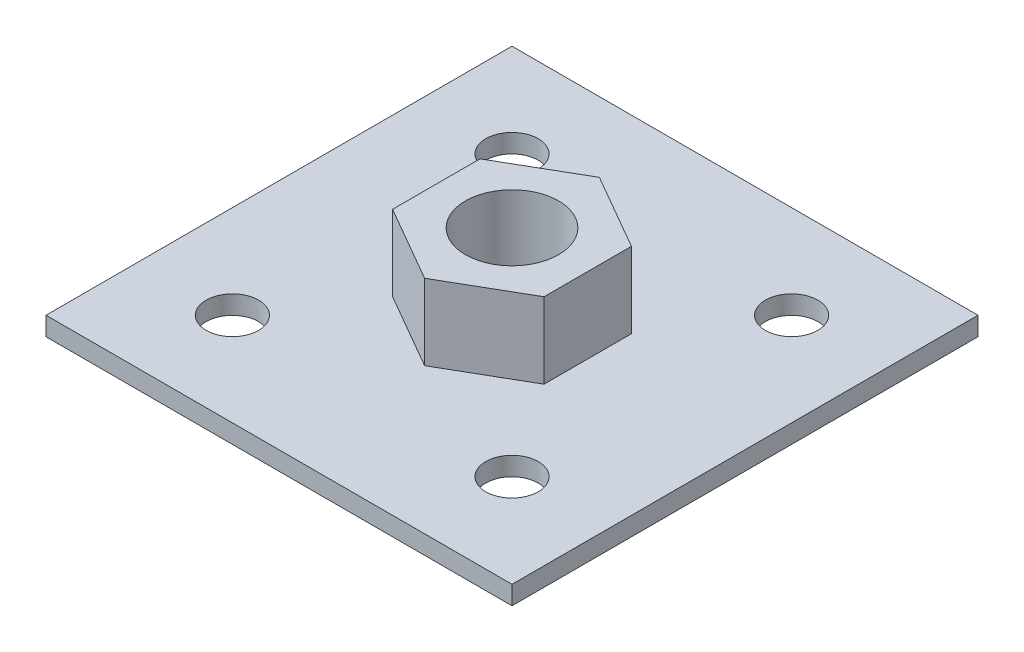
ISO-10303-21;
HEADER;
FILE_DESCRIPTION(('STEP AP214'),'2;1');
FILE_NAME('part.step','',(''),(''),'','','');
FILE_SCHEMA(('AUTOMOTIVE_DESIGN { 1 0 10303 214 1 1 1 1 }'));
ENDSEC;
DATA;
#1=APPLICATION_CONTEXT('core data for automotive mechanical design processes');
#2=APPLICATION_PROTOCOL_DEFINITION('international standard','automotive_design',2000,#1);
#3=PRODUCT_CONTEXT('',#1,'mechanical');
#4=PRODUCT('Part','Part','',(#3));
#5=PRODUCT_RELATED_PRODUCT_CATEGORY('part','',(#4));
#6=PRODUCT_DEFINITION_FORMATION('','',#4);
#7=PRODUCT_DEFINITION_CONTEXT('part definition',#1,'design');
#8=PRODUCT_DEFINITION('design','',#6,#7);
#9=PRODUCT_DEFINITION_SHAPE('','',#8);
#10=(LENGTH_UNIT() NAMED_UNIT(*) SI_UNIT(.MILLI.,.METRE.));
#11=(NAMED_UNIT(*) PLANE_ANGLE_UNIT() SI_UNIT($,.RADIAN.));
#12=(NAMED_UNIT(*) SI_UNIT($,.STERADIAN.) SOLID_ANGLE_UNIT());
#13=UNCERTAINTY_MEASURE_WITH_UNIT(LENGTH_MEASURE(1.E-05),#10,'distance_accuracy_value','');
#14=(GEOMETRIC_REPRESENTATION_CONTEXT(3) GLOBAL_UNCERTAINTY_ASSIGNED_CONTEXT((#13)) GLOBAL_UNIT_ASSIGNED_CONTEXT((#10,
#11,#12)) REPRESENTATION_CONTEXT('',''));
#15=CARTESIAN_POINT('',(0.,0.,0.));
#16=DIRECTION('',(0.,0.,1.));
#17=DIRECTION('',(1.,0.,0.));
#18=AXIS2_PLACEMENT_3D('',#15,#16,#17);
#19=CARTESIAN_POINT('',(0.,1.6,0.));
#20=DIRECTION('',(0.,-1.,0.));
#21=DIRECTION('',(0.,0.,-1.));
#22=AXIS2_PLACEMENT_3D('',#19,#20,#21);
#23=PLANE('',#22);
#24=CARTESIAN_POINT('',(12.,1.6,12.));
#25=DIRECTION('',(0.,1.,0.));
#26=DIRECTION('',(0.,0.,1.));
#27=AXIS2_PLACEMENT_3D('',#24,#25,#26);
#28=CIRCLE('',#27,2.25);
#29=CARTESIAN_POINT('',(12.,1.6,14.25));
#30=VERTEX_POINT('',#29);
#31=EDGE_CURVE('E133',#30,#30,#28,.T.);
#32=ORIENTED_EDGE('',*,*,#31,.F.);
#33=EDGE_LOOP('',(#32));
#34=FACE_BOUND('',#33,.T.);
#35=CARTESIAN_POINT('',(-12.,1.6,12.));
#36=DIRECTION('',(0.,1.,0.));
#37=DIRECTION('',(0.,0.,1.));
#38=AXIS2_PLACEMENT_3D('',#35,#36,#37);
#39=CIRCLE('',#38,2.25);
#40=CARTESIAN_POINT('',(-12.,1.6,14.25));
#41=VERTEX_POINT('',#40);
#42=EDGE_CURVE('E142',#41,#41,#39,.T.);
#43=ORIENTED_EDGE('',*,*,#42,.F.);
#44=EDGE_LOOP('',(#43));
#45=FACE_BOUND('',#44,.T.);
#46=CARTESIAN_POINT('',(12.,1.6,-12.));
#47=DIRECTION('',(0.,1.,0.));
#48=DIRECTION('',(0.,0.,1.));
#49=AXIS2_PLACEMENT_3D('',#46,#47,#48);
#50=CIRCLE('',#49,2.25);
#51=CARTESIAN_POINT('',(12.,1.6,-9.74999999999999));
#52=VERTEX_POINT('',#51);
#53=EDGE_CURVE('E148',#52,#52,#50,.T.);
#54=ORIENTED_EDGE('',*,*,#53,.F.);
#55=EDGE_LOOP('',(#54));
#56=FACE_BOUND('',#55,.T.);
#57=CARTESIAN_POINT('',(-12.,1.6,-12.));
#58=DIRECTION('',(0.,1.,0.));
#59=DIRECTION('',(0.,0.,1.));
#60=AXIS2_PLACEMENT_3D('',#57,#58,#59);
#61=CIRCLE('',#60,2.25);
#62=CARTESIAN_POINT('',(-12.,1.6,-9.74999999999999));
#63=VERTEX_POINT('',#62);
#64=EDGE_CURVE('E154',#63,#63,#61,.T.);
#65=ORIENTED_EDGE('',*,*,#64,.F.);
#66=EDGE_LOOP('',(#65));
#67=FACE_BOUND('',#66,.T.);
#68=DIRECTION('',(0.,0.,-1.));
#69=VECTOR('',#68,1.);
#70=CARTESIAN_POINT('',(20.,1.6,20.));
#71=LINE('',#70,#69);
#72=CARTESIAN_POINT('',(20.,1.6,20.));
#73=VERTEX_POINT('',#72);
#74=CARTESIAN_POINT('',(20.,1.6,-20.));
#75=VERTEX_POINT('',#74);
#76=EDGE_CURVE('E160',#73,#75,#71,.T.);
#77=ORIENTED_EDGE('',*,*,#76,.T.);
#78=DIRECTION('',(-1.,0.,0.));
#79=VECTOR('',#78,1.);
#80=CARTESIAN_POINT('',(-20.,1.6,-20.));
#81=LINE('',#80,#79);
#82=CARTESIAN_POINT('',(-20.,1.6,-20.));
#83=VERTEX_POINT('',#82);
#84=EDGE_CURVE('E163',#75,#83,#81,.T.);
#85=ORIENTED_EDGE('',*,*,#84,.T.);
#86=DIRECTION('',(0.,0.,1.));
#87=VECTOR('',#86,1.);
#88=CARTESIAN_POINT('',(-20.,1.6,20.));
#89=LINE('',#88,#87);
#90=CARTESIAN_POINT('',(-20.,1.6,20.));
#91=VERTEX_POINT('',#90);
#92=EDGE_CURVE('E166',#83,#91,#89,.T.);
#93=ORIENTED_EDGE('',*,*,#92,.T.);
#94=DIRECTION('',(1.,0.,0.));
#95=VECTOR('',#94,1.);
#96=CARTESIAN_POINT('',(-20.,1.6,20.));
#97=LINE('',#96,#95);
#98=EDGE_CURVE('E168',#91,#73,#97,.T.);
#99=ORIENTED_EDGE('',*,*,#98,.T.);
#100=EDGE_LOOP('',(#77,#85,#93,#99));
#101=FACE_BOUND('',#100,.T.);
#102=DIRECTION('',(-0.866281703897573,0.,0.499555812189507));
#103=VECTOR('',#102,1.);
#104=CARTESIAN_POINT('',(-6.5,1.6,-3.75166644450368));
#105=LINE('',#104,#103);
#106=CARTESIAN_POINT('',(0.,1.6,-7.5));
#107=VERTEX_POINT('',#106);
#108=CARTESIAN_POINT('',(-6.5,1.6,-3.75166644450368));
#109=VERTEX_POINT('',#108);
#110=EDGE_CURVE('E48',#107,#109,#105,.T.);
#111=ORIENTED_EDGE('',*,*,#110,.F.);
#112=DIRECTION('',(-0.866281703897573,0.,-0.499555812189507));
#113=VECTOR('',#112,1.);
#114=CARTESIAN_POINT('',(0.,1.6,-7.5));
#115=LINE('',#114,#113);
#116=CARTESIAN_POINT('',(6.5,1.6,-3.75166644450369));
#117=VERTEX_POINT('',#116);
#118=EDGE_CURVE('E52',#117,#107,#115,.T.);
#119=ORIENTED_EDGE('',*,*,#118,.F.);
#120=DIRECTION('',(0.,0.,-1.));
#121=VECTOR('',#120,1.);
#122=CARTESIAN_POINT('',(6.5,1.6,-3.75166644450369));
#123=LINE('',#122,#121);
#124=CARTESIAN_POINT('',(6.5,1.6,3.75166644450368));
#125=VERTEX_POINT('',#124);
#126=EDGE_CURVE('E305',#125,#117,#123,.T.);
#127=ORIENTED_EDGE('',*,*,#126,.F.);
#128=DIRECTION('',(0.866281703897573,0.,-0.499555812189507));
#129=VECTOR('',#128,1.);
#130=CARTESIAN_POINT('',(6.5,1.6,3.75166644450368));
#131=LINE('',#130,#129);
#132=CARTESIAN_POINT('',(0.,1.6,7.5));
#133=VERTEX_POINT('',#132);
#134=EDGE_CURVE('E302',#133,#125,#131,.T.);
#135=ORIENTED_EDGE('',*,*,#134,.F.);
#136=DIRECTION('',(0.866281703897573,0.,0.499555812189507));
#137=VECTOR('',#136,1.);
#138=CARTESIAN_POINT('',(0.,1.6,7.5));
#139=LINE('',#138,#137);
#140=CARTESIAN_POINT('',(-6.5,1.6,3.75166644450368));
#141=VERTEX_POINT('',#140);
#142=EDGE_CURVE('E299',#141,#133,#139,.T.);
#143=ORIENTED_EDGE('',*,*,#142,.F.);
#144=DIRECTION('',(0.,0.,1.));
#145=VECTOR('',#144,1.);
#146=CARTESIAN_POINT('',(-6.5,1.6,3.75166644450368));
#147=LINE('',#146,#145);
#148=EDGE_CURVE('E297',#109,#141,#147,.T.);
#149=ORIENTED_EDGE('',*,*,#148,.F.);
#150=EDGE_LOOP('',(#111,#119,#127,#135,#143,#149));
#151=FACE_BOUND('',#150,.T.);
#152=ADVANCED_FACE('F33',(#34,#45,#56,#67,#101,#151),#23,.F.);
#153=CARTESIAN_POINT('',(0.,0.,0.));
#154=DIRECTION('',(0.,-1.,0.));
#155=DIRECTION('',(0.,0.,-1.));
#156=AXIS2_PLACEMENT_3D('',#153,#154,#155);
#157=PLANE('',#156);
#158=CARTESIAN_POINT('',(0.,0.,0.));
#159=DIRECTION('',(0.,1.,0.));
#160=DIRECTION('',(0.,0.,1.));
#161=AXIS2_PLACEMENT_3D('',#158,#159,#160);
#162=CIRCLE('',#161,4.);
#163=CARTESIAN_POINT('',(0.,0.,4.));
#164=VERTEX_POINT('',#163);
#165=EDGE_CURVE('E282',#164,#164,#162,.T.);
#166=ORIENTED_EDGE('',*,*,#165,.T.);
#167=EDGE_LOOP('',(#166));
#168=FACE_BOUND('',#167,.T.);
#169=CARTESIAN_POINT('',(-12.,0.,12.));
#170=DIRECTION('',(0.,1.,0.));
#171=DIRECTION('',(0.,0.,1.));
#172=AXIS2_PLACEMENT_3D('',#169,#170,#171);
#173=CIRCLE('',#172,2.25);
#174=CARTESIAN_POINT('',(-12.,0.,14.25));
#175=VERTEX_POINT('',#174);
#176=EDGE_CURVE('E140',#175,#175,#173,.T.);
#177=ORIENTED_EDGE('',*,*,#176,.T.);
#178=EDGE_LOOP('',(#177));
#179=FACE_BOUND('',#178,.T.);
#180=CARTESIAN_POINT('',(-12.,0.,-12.));
#181=DIRECTION('',(0.,1.,0.));
#182=DIRECTION('',(0.,0.,1.));
#183=AXIS2_PLACEMENT_3D('',#180,#181,#182);
#184=CIRCLE('',#183,2.25);
#185=CARTESIAN_POINT('',(-12.,0.,-9.74999999999999));
#186=VERTEX_POINT('',#185);
#187=EDGE_CURVE('E151',#186,#186,#184,.T.);
#188=ORIENTED_EDGE('',*,*,#187,.T.);
#189=EDGE_LOOP('',(#188));
#190=FACE_BOUND('',#189,.T.);
#191=DIRECTION('',(0.,0.,-1.));
#192=VECTOR('',#191,1.);
#193=CARTESIAN_POINT('',(20.,0.,20.));
#194=LINE('',#193,#192);
#195=CARTESIAN_POINT('',(20.,0.,20.));
#196=VERTEX_POINT('',#195);
#197=CARTESIAN_POINT('',(20.,0.,-20.));
#198=VERTEX_POINT('',#197);
#199=EDGE_CURVE('E157',#196,#198,#194,.T.);
#200=ORIENTED_EDGE('',*,*,#199,.F.);
#201=DIRECTION('',(1.,0.,0.));
#202=VECTOR('',#201,1.);
#203=CARTESIAN_POINT('',(-20.,0.,20.));
#204=LINE('',#203,#202);
#205=CARTESIAN_POINT('',(-20.,0.,20.));
#206=VERTEX_POINT('',#205);
#207=EDGE_CURVE('E164',#206,#196,#204,.T.);
#208=ORIENTED_EDGE('',*,*,#207,.F.);
#209=DIRECTION('',(0.,0.,1.));
#210=VECTOR('',#209,1.);
#211=CARTESIAN_POINT('',(-20.,0.,20.));
#212=LINE('',#211,#210);
#213=CARTESIAN_POINT('',(-20.,0.,-20.));
#214=VERTEX_POINT('',#213);
#215=EDGE_CURVE('E175',#214,#206,#212,.T.);
#216=ORIENTED_EDGE('',*,*,#215,.F.);
#217=DIRECTION('',(-1.,0.,0.));
#218=VECTOR('',#217,1.);
#219=CARTESIAN_POINT('',(-20.,0.,-20.));
#220=LINE('',#219,#218);
#221=EDGE_CURVE('E173',#198,#214,#220,.T.);
#222=ORIENTED_EDGE('',*,*,#221,.F.);
#223=EDGE_LOOP('',(#200,#208,#216,#222));
#224=FACE_BOUND('',#223,.T.);
#225=CARTESIAN_POINT('',(12.,0.,-12.));
#226=DIRECTION('',(0.,1.,0.));
#227=DIRECTION('',(0.,0.,1.));
#228=AXIS2_PLACEMENT_3D('',#225,#226,#227);
#229=CIRCLE('',#228,2.25);
#230=CARTESIAN_POINT('',(12.,0.,-9.74999999999999));
#231=VERTEX_POINT('',#230);
#232=EDGE_CURVE('E145',#231,#231,#229,.T.);
#233=ORIENTED_EDGE('',*,*,#232,.T.);
#234=EDGE_LOOP('',(#233));
#235=FACE_BOUND('',#234,.T.);
#236=CARTESIAN_POINT('',(12.,0.,12.));
#237=DIRECTION('',(0.,1.,0.));
#238=DIRECTION('',(0.,0.,1.));
#239=AXIS2_PLACEMENT_3D('',#236,#237,#238);
#240=CIRCLE('',#239,2.25);
#241=CARTESIAN_POINT('',(12.,0.,14.25));
#242=VERTEX_POINT('',#241);
#243=EDGE_CURVE('E130',#242,#242,#240,.T.);
#244=ORIENTED_EDGE('',*,*,#243,.T.);
#245=EDGE_LOOP('',(#244));
#246=FACE_BOUND('',#245,.T.);
#247=ADVANCED_FACE('F193',(#168,#179,#190,#224,#235,#246),#157,.T.);
#248=CARTESIAN_POINT('',(20.,1.6,20.));
#249=DIRECTION('',(-1.,0.,0.));
#250=DIRECTION('',(0.,0.,1.));
#251=AXIS2_PLACEMENT_3D('',#248,#249,#250);
#252=PLANE('',#251);
#253=ORIENTED_EDGE('',*,*,#199,.T.);
#254=DIRECTION('',(0.,-1.,0.));
#255=VECTOR('',#254,1.);
#256=CARTESIAN_POINT('',(20.,1.6,-20.));
#257=LINE('',#256,#255);
#258=EDGE_CURVE('E11',#75,#198,#257,.T.);
#259=ORIENTED_EDGE('',*,*,#258,.F.);
#260=ORIENTED_EDGE('',*,*,#76,.F.);
#261=DIRECTION('',(0.,-1.,0.));
#262=VECTOR('',#261,1.);
#263=CARTESIAN_POINT('',(20.,1.6,20.));
#264=LINE('',#263,#262);
#265=EDGE_CURVE('E170',#73,#196,#264,.T.);
#266=ORIENTED_EDGE('',*,*,#265,.T.);
#267=EDGE_LOOP('',(#253,#259,#260,#266));
#268=FACE_BOUND('',#267,.T.);
#269=ADVANCED_FACE('F35',(#268),#252,.F.);
#270=CARTESIAN_POINT('',(-20.,1.6,-20.));
#271=DIRECTION('',(0.,0.,1.));
#272=DIRECTION('',(1.,0.,0.));
#273=AXIS2_PLACEMENT_3D('',#270,#271,#272);
#274=PLANE('',#273);
#275=ORIENTED_EDGE('',*,*,#221,.T.);
#276=DIRECTION('',(0.,-1.,0.));
#277=VECTOR('',#276,1.);
#278=CARTESIAN_POINT('',(-20.,1.6,-20.));
#279=LINE('',#278,#277);
#280=EDGE_CURVE('E41',#83,#214,#279,.T.);
#281=ORIENTED_EDGE('',*,*,#280,.F.);
#282=ORIENTED_EDGE('',*,*,#84,.F.);
#283=ORIENTED_EDGE('',*,*,#258,.T.);
#284=EDGE_LOOP('',(#275,#281,#282,#283));
#285=FACE_BOUND('',#284,.T.);
#286=ADVANCED_FACE('F203',(#285),#274,.F.);
#287=CARTESIAN_POINT('',(-20.,1.6,20.));
#288=DIRECTION('',(1.,0.,0.));
#289=DIRECTION('',(0.,0.,-1.));
#290=AXIS2_PLACEMENT_3D('',#287,#288,#289);
#291=PLANE('',#290);
#292=ORIENTED_EDGE('',*,*,#215,.T.);
#293=DIRECTION('',(0.,-1.,0.));
#294=VECTOR('',#293,1.);
#295=CARTESIAN_POINT('',(-20.,1.6,20.));
#296=LINE('',#295,#294);
#297=EDGE_CURVE('E180',#91,#206,#296,.T.);
#298=ORIENTED_EDGE('',*,*,#297,.F.);
#299=ORIENTED_EDGE('',*,*,#92,.F.);
#300=ORIENTED_EDGE('',*,*,#280,.T.);
#301=EDGE_LOOP('',(#292,#298,#299,#300));
#302=FACE_BOUND('',#301,.T.);
#303=ADVANCED_FACE('F187',(#302),#291,.F.);
#304=CARTESIAN_POINT('',(-20.,1.6,20.));
#305=DIRECTION('',(0.,0.,-1.));
#306=DIRECTION('',(-1.,0.,0.));
#307=AXIS2_PLACEMENT_3D('',#304,#305,#306);
#308=PLANE('',#307);
#309=ORIENTED_EDGE('',*,*,#207,.T.);
#310=ORIENTED_EDGE('',*,*,#265,.F.);
#311=ORIENTED_EDGE('',*,*,#98,.F.);
#312=ORIENTED_EDGE('',*,*,#297,.T.);
#313=EDGE_LOOP('',(#309,#310,#311,#312));
#314=FACE_BOUND('',#313,.T.);
#315=ADVANCED_FACE('F197',(#314),#308,.F.);
#316=CARTESIAN_POINT('',(-12.,1.6,-12.));
#317=DIRECTION('',(0.,-1.,0.));
#318=DIRECTION('',(0.,0.,-1.));
#319=AXIS2_PLACEMENT_3D('',#316,#317,#318);
#320=CYLINDRICAL_SURFACE('',#319,2.25);
#321=ORIENTED_EDGE('',*,*,#64,.T.);
#322=EDGE_LOOP('',(#321));
#323=FACE_BOUND('',#322,.T.);
#324=ORIENTED_EDGE('',*,*,#187,.F.);
#325=EDGE_LOOP('',(#324));
#326=FACE_BOUND('',#325,.T.);
#327=ADVANCED_FACE('F221',(#323,#326),#320,.F.);
#328=CARTESIAN_POINT('',(12.,1.6,-12.));
#329=DIRECTION('',(0.,-1.,0.));
#330=DIRECTION('',(0.,0.,-1.));
#331=AXIS2_PLACEMENT_3D('',#328,#329,#330);
#332=CYLINDRICAL_SURFACE('',#331,2.25);
#333=ORIENTED_EDGE('',*,*,#53,.T.);
#334=EDGE_LOOP('',(#333));
#335=FACE_BOUND('',#334,.T.);
#336=ORIENTED_EDGE('',*,*,#232,.F.);
#337=EDGE_LOOP('',(#336));
#338=FACE_BOUND('',#337,.T.);
#339=ADVANCED_FACE('F228',(#335,#338),#332,.F.);
#340=CARTESIAN_POINT('',(-12.,1.6,12.));
#341=DIRECTION('',(0.,-1.,0.));
#342=DIRECTION('',(0.,0.,-1.));
#343=AXIS2_PLACEMENT_3D('',#340,#341,#342);
#344=CYLINDRICAL_SURFACE('',#343,2.25);
#345=ORIENTED_EDGE('',*,*,#42,.T.);
#346=EDGE_LOOP('',(#345));
#347=FACE_BOUND('',#346,.T.);
#348=ORIENTED_EDGE('',*,*,#176,.F.);
#349=EDGE_LOOP('',(#348));
#350=FACE_BOUND('',#349,.T.);
#351=ADVANCED_FACE('F233',(#347,#350),#344,.F.);
#352=CARTESIAN_POINT('',(12.,1.6,12.));
#353=DIRECTION('',(0.,-1.,0.));
#354=DIRECTION('',(0.,0.,-1.));
#355=AXIS2_PLACEMENT_3D('',#352,#353,#354);
#356=CYLINDRICAL_SURFACE('',#355,2.25);
#357=ORIENTED_EDGE('',*,*,#31,.T.);
#358=EDGE_LOOP('',(#357));
#359=FACE_BOUND('',#358,.T.);
#360=ORIENTED_EDGE('',*,*,#243,.F.);
#361=EDGE_LOOP('',(#360));
#362=FACE_BOUND('',#361,.T.);
#363=ADVANCED_FACE('F243',(#359,#362),#356,.F.);
#364=CARTESIAN_POINT('',(-6.5,8.1,-3.75166644450368));
#365=DIRECTION('',(0.499555812189507,0.,0.866281703897573));
#366=DIRECTION('',(0.866281703897573,0.,-0.499555812189507));
#367=AXIS2_PLACEMENT_3D('',#364,#365,#366);
#368=PLANE('',#367);
#369=ORIENTED_EDGE('',*,*,#110,.T.);
#370=DIRECTION('',(0.,-1.,0.));
#371=VECTOR('',#370,1.);
#372=CARTESIAN_POINT('',(-6.5,8.1,-3.75166644450368));
#373=LINE('',#372,#371);
#374=CARTESIAN_POINT('',(-6.5,8.1,-3.75166644450368));
#375=VERTEX_POINT('',#374);
#376=EDGE_CURVE('E113',#375,#109,#373,.T.);
#377=ORIENTED_EDGE('',*,*,#376,.F.);
#378=DIRECTION('',(-0.866281703897573,0.,0.499555812189507));
#379=VECTOR('',#378,1.);
#380=CARTESIAN_POINT('',(-6.5,8.1,-3.75166644450368));
#381=LINE('',#380,#379);
#382=CARTESIAN_POINT('',(0.,8.1,-7.5));
#383=VERTEX_POINT('',#382);
#384=EDGE_CURVE('E119',#383,#375,#381,.T.);
#385=ORIENTED_EDGE('',*,*,#384,.F.);
#386=DIRECTION('',(0.,-1.,0.));
#387=VECTOR('',#386,1.);
#388=CARTESIAN_POINT('',(0.,8.1,-7.5));
#389=LINE('',#388,#387);
#390=EDGE_CURVE('E295',#383,#107,#389,.T.);
#391=ORIENTED_EDGE('',*,*,#390,.T.);
#392=EDGE_LOOP('',(#369,#377,#385,#391));
#393=FACE_BOUND('',#392,.T.);
#394=ADVANCED_FACE('F129',(#393),#368,.F.);
#395=CARTESIAN_POINT('',(-6.5,8.1,3.75166644450368));
#396=DIRECTION('',(1.,0.,0.));
#397=DIRECTION('',(0.,0.,-1.));
#398=AXIS2_PLACEMENT_3D('',#395,#396,#397);
#399=PLANE('',#398);
#400=ORIENTED_EDGE('',*,*,#148,.T.);
#401=DIRECTION('',(0.,-1.,0.));
#402=VECTOR('',#401,1.);
#403=CARTESIAN_POINT('',(-6.5,8.1,3.75166644450368));
#404=LINE('',#403,#402);
#405=CARTESIAN_POINT('',(-6.5,8.1,3.75166644450368));
#406=VERTEX_POINT('',#405);
#407=EDGE_CURVE('E115',#406,#141,#404,.T.);
#408=ORIENTED_EDGE('',*,*,#407,.F.);
#409=DIRECTION('',(0.,0.,1.));
#410=VECTOR('',#409,1.);
#411=CARTESIAN_POINT('',(-6.5,8.1,3.75166644450368));
#412=LINE('',#411,#410);
#413=EDGE_CURVE('E108',#375,#406,#412,.T.);
#414=ORIENTED_EDGE('',*,*,#413,.F.);
#415=ORIENTED_EDGE('',*,*,#376,.T.);
#416=EDGE_LOOP('',(#400,#408,#414,#415));
#417=FACE_BOUND('',#416,.T.);
#418=ADVANCED_FACE('F111',(#417),#399,.F.);
#419=CARTESIAN_POINT('',(0.,8.1,7.5));
#420=DIRECTION('',(0.499555812189507,0.,-0.866281703897573));
#421=DIRECTION('',(-0.866281703897573,0.,-0.499555812189507));
#422=AXIS2_PLACEMENT_3D('',#419,#420,#421);
#423=PLANE('',#422);
#424=ORIENTED_EDGE('',*,*,#142,.T.);
#425=DIRECTION('',(0.,-1.,0.));
#426=VECTOR('',#425,1.);
#427=CARTESIAN_POINT('',(0.,8.1,7.5));
#428=LINE('',#427,#426);
#429=CARTESIAN_POINT('',(0.,8.1,7.5));
#430=VERTEX_POINT('',#429);
#431=EDGE_CURVE('E135',#430,#133,#428,.T.);
#432=ORIENTED_EDGE('',*,*,#431,.F.);
#433=DIRECTION('',(0.866281703897573,0.,0.499555812189507));
#434=VECTOR('',#433,1.);
#435=CARTESIAN_POINT('',(0.,8.1,7.5));
#436=LINE('',#435,#434);
#437=EDGE_CURVE('E118',#406,#430,#436,.T.);
#438=ORIENTED_EDGE('',*,*,#437,.F.);
#439=ORIENTED_EDGE('',*,*,#407,.T.);
#440=EDGE_LOOP('',(#424,#432,#438,#439));
#441=FACE_BOUND('',#440,.T.);
#442=ADVANCED_FACE('F255',(#441),#423,.F.);
#443=CARTESIAN_POINT('',(6.5,8.1,3.75166644450368));
#444=DIRECTION('',(-0.499555812189507,0.,-0.866281703897573));
#445=DIRECTION('',(-0.866281703897573,0.,0.499555812189507));
#446=AXIS2_PLACEMENT_3D('',#443,#444,#445);
#447=PLANE('',#446);
#448=ORIENTED_EDGE('',*,*,#134,.T.);
#449=DIRECTION('',(0.,-1.,0.));
#450=VECTOR('',#449,1.);
#451=CARTESIAN_POINT('',(6.5,8.1,3.75166644450368));
#452=LINE('',#451,#450);
#453=CARTESIAN_POINT('',(6.5,8.1,3.75166644450368));
#454=VERTEX_POINT('',#453);
#455=EDGE_CURVE('E312',#454,#125,#452,.T.);
#456=ORIENTED_EDGE('',*,*,#455,.F.);
#457=DIRECTION('',(0.866281703897573,0.,-0.499555812189507));
#458=VECTOR('',#457,1.);
#459=CARTESIAN_POINT('',(6.5,8.1,3.75166644450368));
#460=LINE('',#459,#458);
#461=EDGE_CURVE('E290',#430,#454,#460,.T.);
#462=ORIENTED_EDGE('',*,*,#461,.F.);
#463=ORIENTED_EDGE('',*,*,#431,.T.);
#464=EDGE_LOOP('',(#448,#456,#462,#463));
#465=FACE_BOUND('',#464,.T.);
#466=ADVANCED_FACE('F258',(#465),#447,.F.);
#467=CARTESIAN_POINT('',(6.5,8.1,-3.75166644450369));
#468=DIRECTION('',(-1.,0.,0.));
#469=DIRECTION('',(0.,0.,1.));
#470=AXIS2_PLACEMENT_3D('',#467,#468,#469);
#471=PLANE('',#470);
#472=ORIENTED_EDGE('',*,*,#126,.T.);
#473=DIRECTION('',(0.,-1.,0.));
#474=VECTOR('',#473,1.);
#475=CARTESIAN_POINT('',(6.5,8.1,-3.75166644450369));
#476=LINE('',#475,#474);
#477=CARTESIAN_POINT('',(6.5,8.1,-3.75166644450369));
#478=VERTEX_POINT('',#477);
#479=EDGE_CURVE('E309',#478,#117,#476,.T.);
#480=ORIENTED_EDGE('',*,*,#479,.F.);
#481=DIRECTION('',(0.,0.,-1.));
#482=VECTOR('',#481,1.);
#483=CARTESIAN_POINT('',(6.5,8.1,-3.75166644450369));
#484=LINE('',#483,#482);
#485=EDGE_CURVE('E292',#454,#478,#484,.T.);
#486=ORIENTED_EDGE('',*,*,#485,.F.);
#487=ORIENTED_EDGE('',*,*,#455,.T.);
#488=EDGE_LOOP('',(#472,#480,#486,#487));
#489=FACE_BOUND('',#488,.T.);
#490=ADVANCED_FACE('F262',(#489),#471,.F.);
#491=CARTESIAN_POINT('',(0.,8.1,-7.5));
#492=DIRECTION('',(-0.499555812189507,0.,0.866281703897573));
#493=DIRECTION('',(0.866281703897573,0.,0.499555812189507));
#494=AXIS2_PLACEMENT_3D('',#491,#492,#493);
#495=PLANE('',#494);
#496=ORIENTED_EDGE('',*,*,#118,.T.);
#497=ORIENTED_EDGE('',*,*,#390,.F.);
#498=DIRECTION('',(-0.866281703897573,0.,-0.499555812189507));
#499=VECTOR('',#498,1.);
#500=CARTESIAN_POINT('',(0.,8.1,-7.5));
#501=LINE('',#500,#499);
#502=EDGE_CURVE('E124',#478,#383,#501,.T.);
#503=ORIENTED_EDGE('',*,*,#502,.F.);
#504=ORIENTED_EDGE('',*,*,#479,.T.);
#505=EDGE_LOOP('',(#496,#497,#503,#504));
#506=FACE_BOUND('',#505,.T.);
#507=ADVANCED_FACE('F266',(#506),#495,.F.);
#508=CARTESIAN_POINT('',(0.,8.1,0.));
#509=DIRECTION('',(0.,-1.,0.));
#510=DIRECTION('',(0.,0.,-1.));
#511=AXIS2_PLACEMENT_3D('',#508,#509,#510);
#512=PLANE('',#511);
#513=CARTESIAN_POINT('',(0.,8.1,0.));
#514=DIRECTION('',(0.,1.,0.));
#515=DIRECTION('',(0.,0.,1.));
#516=AXIS2_PLACEMENT_3D('',#513,#514,#515);
#517=CIRCLE('',#516,4.);
#518=CARTESIAN_POINT('',(0.,8.1,4.));
#519=VERTEX_POINT('',#518);
#520=EDGE_CURVE('E285',#519,#519,#517,.T.);
#521=ORIENTED_EDGE('',*,*,#520,.F.);
#522=EDGE_LOOP('',(#521));
#523=FACE_BOUND('',#522,.T.);
#524=ORIENTED_EDGE('',*,*,#384,.T.);
#525=ORIENTED_EDGE('',*,*,#413,.T.);
#526=ORIENTED_EDGE('',*,*,#437,.T.);
#527=ORIENTED_EDGE('',*,*,#461,.T.);
#528=ORIENTED_EDGE('',*,*,#485,.T.);
#529=ORIENTED_EDGE('',*,*,#502,.T.);
#530=EDGE_LOOP('',(#524,#525,#526,#527,#528,#529));
#531=FACE_BOUND('',#530,.T.);
#532=ADVANCED_FACE('F122',(#523,#531),#512,.F.);
#533=CARTESIAN_POINT('',(0.,0.,0.));
#534=DIRECTION('',(0.,1.,0.));
#535=DIRECTION('',(0.,0.,1.));
#536=AXIS2_PLACEMENT_3D('',#533,#534,#535);
#537=CYLINDRICAL_SURFACE('',#536,4.);
#538=ORIENTED_EDGE('',*,*,#165,.F.);
#539=EDGE_LOOP('',(#538));
#540=FACE_BOUND('',#539,.T.);
#541=ORIENTED_EDGE('',*,*,#520,.T.);
#542=EDGE_LOOP('',(#541));
#543=FACE_BOUND('',#542,.T.);
#544=ADVANCED_FACE('F273',(#540,#543),#537,.F.);
#545=CLOSED_SHELL('',(#152,#247,#269,#286,#303,#315,#327,#339,#351,#363,#394,#418,#442,#466,
#490,#507,#532,#544));
#546=MANIFOLD_SOLID_BREP('B2',#545);
#547=ADVANCED_BREP_SHAPE_REPRESENTATION('',(#18,#546),#14);
#548=SHAPE_DEFINITION_REPRESENTATION(#9,#547);
ENDSEC;
END-ISO-10303-21;
